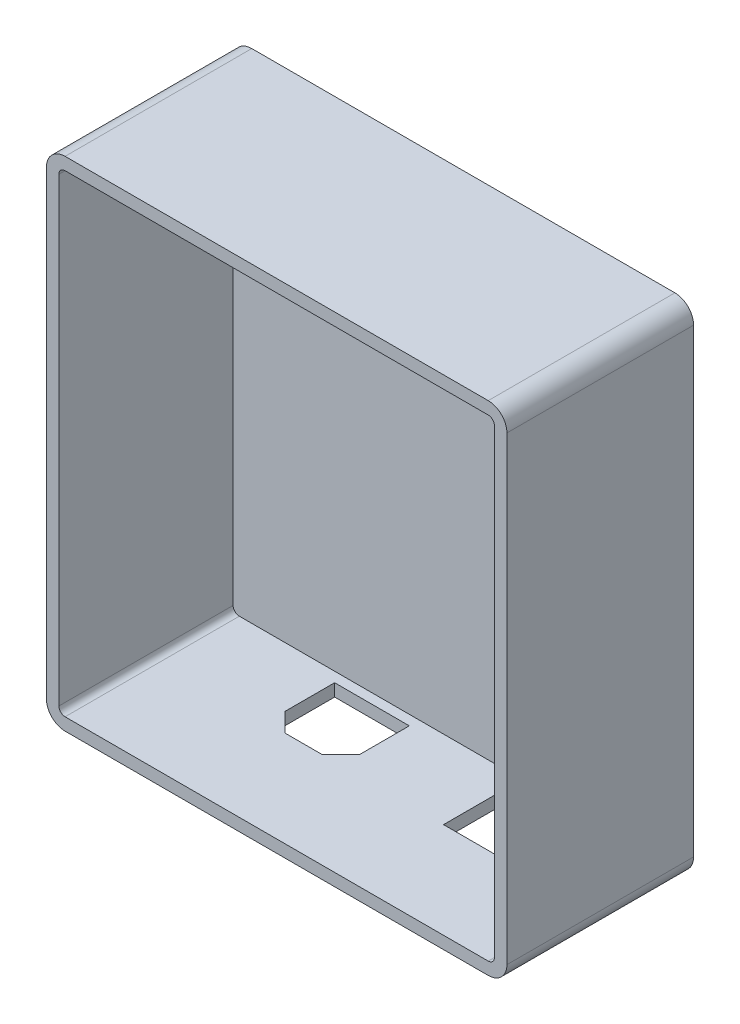
ISO-10303-21;
HEADER;
FILE_DESCRIPTION(('STEP AP214'),'2;1');
FILE_NAME('part.step','',(''),(''),'','','');
FILE_SCHEMA(('AUTOMOTIVE_DESIGN { 1 0 10303 214 1 1 1 1 }'));
ENDSEC;
DATA;
#1=APPLICATION_CONTEXT('core data for automotive mechanical design processes');
#2=APPLICATION_PROTOCOL_DEFINITION('international standard','automotive_design',2000,#1);
#3=PRODUCT_CONTEXT('',#1,'mechanical');
#4=PRODUCT('Part','Part','',(#3));
#5=PRODUCT_RELATED_PRODUCT_CATEGORY('part','',(#4));
#6=PRODUCT_DEFINITION_FORMATION('','',#4);
#7=PRODUCT_DEFINITION_CONTEXT('part definition',#1,'design');
#8=PRODUCT_DEFINITION('design','',#6,#7);
#9=PRODUCT_DEFINITION_SHAPE('','',#8);
#10=(LENGTH_UNIT() NAMED_UNIT(*) SI_UNIT(.MILLI.,.METRE.));
#11=(NAMED_UNIT(*) PLANE_ANGLE_UNIT() SI_UNIT($,.RADIAN.));
#12=(NAMED_UNIT(*) SI_UNIT($,.STERADIAN.) SOLID_ANGLE_UNIT());
#13=UNCERTAINTY_MEASURE_WITH_UNIT(LENGTH_MEASURE(1.E-05),#10,'distance_accuracy_value','');
#14=(GEOMETRIC_REPRESENTATION_CONTEXT(3) GLOBAL_UNCERTAINTY_ASSIGNED_CONTEXT((#13)) GLOBAL_UNIT_ASSIGNED_CONTEXT((#10,
#11,#12)) REPRESENTATION_CONTEXT('',''));
#15=CARTESIAN_POINT('',(0.,0.,0.));
#16=DIRECTION('',(0.,0.,1.));
#17=DIRECTION('',(1.,0.,0.));
#18=AXIS2_PLACEMENT_3D('',#15,#16,#17);
#19=CARTESIAN_POINT('',(-28.9172141918528,-56.2049934296978,30.));
#20=DIRECTION('',(0.,0.,-1.));
#21=DIRECTION('',(-1.,0.,0.));
#22=AXIS2_PLACEMENT_3D('',#19,#20,#21);
#23=CYLINDRICAL_SURFACE('',#22,3.);
#24=CARTESIAN_POINT('',(-28.9172141918528,-56.2049934296978,0.));
#25=DIRECTION('',(0.,0.,1.));
#26=DIRECTION('',(1.,0.,0.));
#27=AXIS2_PLACEMENT_3D('',#24,#25,#26);
#28=CIRCLE('',#27,3.);
#29=CARTESIAN_POINT('',(-31.9172141918528,-56.2049934296978,0.));
#30=VERTEX_POINT('',#29);
#31=CARTESIAN_POINT('',(-28.9172141918528,-59.2049934296978,0.));
#32=VERTEX_POINT('',#31);
#33=EDGE_CURVE('E321',#30,#32,#28,.T.);
#34=ORIENTED_EDGE('',*,*,#33,.T.);
#35=DIRECTION('',(0.,0.,-1.));
#36=VECTOR('',#35,1.);
#37=CARTESIAN_POINT('',(-28.9172141918528,-59.2049934296978,30.));
#38=LINE('',#37,#36);
#39=CARTESIAN_POINT('',(-28.9172141918528,-59.2049934296978,30.));
#40=VERTEX_POINT('',#39);
#41=EDGE_CURVE('E390',#40,#32,#38,.T.);
#42=ORIENTED_EDGE('',*,*,#41,.F.);
#43=CARTESIAN_POINT('',(-28.9172141918528,-56.2049934296978,30.));
#44=DIRECTION('',(0.,0.,1.));
#45=DIRECTION('',(1.,0.,0.));
#46=AXIS2_PLACEMENT_3D('',#43,#44,#45);
#47=CIRCLE('',#46,3.);
#48=CARTESIAN_POINT('',(-31.9172141918528,-56.2049934296978,30.));
#49=VERTEX_POINT('',#48);
#50=EDGE_CURVE('E336',#49,#40,#47,.T.);
#51=ORIENTED_EDGE('',*,*,#50,.F.);
#52=DIRECTION('',(0.,0.,-1.));
#53=VECTOR('',#52,1.);
#54=CARTESIAN_POINT('',(-31.9172141918528,-56.2049934296978,30.));
#55=LINE('',#54,#53);
#56=EDGE_CURVE('E354',#49,#30,#55,.T.);
#57=ORIENTED_EDGE('',*,*,#56,.T.);
#58=EDGE_LOOP('',(#34,#42,#51,#57));
#59=FACE_BOUND('',#58,.T.);
#60=ADVANCED_FACE('F37',(#59),#23,.T.);
#61=CARTESIAN_POINT('',(-28.9172141918528,-59.2049934296978,30.));
#62=DIRECTION('',(0.,1.,0.));
#63=DIRECTION('',(0.,0.,1.));
#64=AXIS2_PLACEMENT_3D('',#61,#62,#63);
#65=PLANE('',#64);
#66=DIRECTION('',(1.,0.,0.));
#67=VECTOR('',#66,1.);
#68=CARTESIAN_POINT('',(0.,-59.2049934296978,3.6));
#69=LINE('',#68,#67);
#70=CARTESIAN_POINT('',(-12.,-59.2049934296978,3.6));
#71=VERTEX_POINT('',#70);
#72=CARTESIAN_POINT('',(0.,-59.2049934296978,3.6));
#73=VERTEX_POINT('',#72);
#74=EDGE_CURVE('E226',#71,#73,#69,.T.);
#75=ORIENTED_EDGE('',*,*,#74,.F.);
#76=DIRECTION('',(0.,0.,-1.));
#77=VECTOR('',#76,1.);
#78=CARTESIAN_POINT('',(-12.,-59.2049934296978,3.6));
#79=LINE('',#78,#77);
#80=CARTESIAN_POINT('',(-12.,-59.2049934296978,11.6));
#81=VERTEX_POINT('',#80);
#82=EDGE_CURVE('E51',#81,#71,#79,.T.);
#83=ORIENTED_EDGE('',*,*,#82,.F.);
#84=DIRECTION('',(-0.707106781186547,0.,-0.707106781186548));
#85=VECTOR('',#84,1.);
#86=CARTESIAN_POINT('',(-12.,-59.2049934296978,11.6));
#87=LINE('',#86,#85);
#88=CARTESIAN_POINT('',(-9.00186724776904,-59.2049934296978,14.598132752231));
#89=VERTEX_POINT('',#88);
#90=EDGE_CURVE('E242',#89,#81,#87,.T.);
#91=ORIENTED_EDGE('',*,*,#90,.F.);
#92=DIRECTION('',(-1.,0.,0.));
#93=VECTOR('',#92,1.);
#94=CARTESIAN_POINT('',(-9.00186724776904,-59.2049934296978,14.598132752231));
#95=LINE('',#94,#93);
#96=CARTESIAN_POINT('',(-3.00186724776904,-59.2049934296978,14.598132752231));
#97=VERTEX_POINT('',#96);
#98=EDGE_CURVE('E236',#97,#89,#95,.T.);
#99=ORIENTED_EDGE('',*,*,#98,.F.);
#100=DIRECTION('',(-0.707987558436095,0.,0.70622490546546));
#101=VECTOR('',#100,1.);
#102=CARTESIAN_POINT('',(-3.00186724776904,-59.2049934296978,14.598132752231));
#103=LINE('',#102,#101);
#104=CARTESIAN_POINT('',(0.,-59.2049934296978,11.6037391530574));
#105=VERTEX_POINT('',#104);
#106=EDGE_CURVE('E234',#105,#97,#103,.T.);
#107=ORIENTED_EDGE('',*,*,#106,.F.);
#108=DIRECTION('',(0.,0.,1.));
#109=VECTOR('',#108,1.);
#110=CARTESIAN_POINT('',(0.,-59.2049934296978,11.6037391530574));
#111=LINE('',#110,#109);
#112=EDGE_CURVE('E216',#73,#105,#111,.T.);
#113=ORIENTED_EDGE('',*,*,#112,.F.);
#114=EDGE_LOOP('',(#75,#83,#91,#99,#107,#113));
#115=FACE_BOUND('',#114,.T.);
#116=DIRECTION('',(1.,0.,0.));
#117=VECTOR('',#116,1.);
#118=CARTESIAN_POINT('',(16.5,-59.2049934296978,3.6));
#119=LINE('',#118,#117);
#120=CARTESIAN_POINT('',(16.5,-59.2049934296978,3.6));
#121=VERTEX_POINT('',#120);
#122=CARTESIAN_POINT('',(25.5,-59.2049934296978,3.6));
#123=VERTEX_POINT('',#122);
#124=EDGE_CURVE('E255',#121,#123,#119,.T.);
#125=ORIENTED_EDGE('',*,*,#124,.F.);
#126=DIRECTION('',(0.,0.,-1.));
#127=VECTOR('',#126,1.);
#128=CARTESIAN_POINT('',(16.5,-59.2049934296978,14.6));
#129=LINE('',#128,#127);
#130=CARTESIAN_POINT('',(16.5,-59.2049934296978,14.6));
#131=VERTEX_POINT('',#130);
#132=EDGE_CURVE('E59',#131,#121,#129,.T.);
#133=ORIENTED_EDGE('',*,*,#132,.F.);
#134=DIRECTION('',(-1.,0.,0.));
#135=VECTOR('',#134,1.);
#136=CARTESIAN_POINT('',(16.5,-59.2049934296978,14.6));
#137=LINE('',#136,#135);
#138=CARTESIAN_POINT('',(25.5,-59.2049934296978,14.6));
#139=VERTEX_POINT('',#138);
#140=EDGE_CURVE('E261',#139,#131,#137,.T.);
#141=ORIENTED_EDGE('',*,*,#140,.F.);
#142=DIRECTION('',(0.,0.,1.));
#143=VECTOR('',#142,1.);
#144=CARTESIAN_POINT('',(25.5,-59.2049934296978,14.6));
#145=LINE('',#144,#143);
#146=EDGE_CURVE('E258',#123,#139,#145,.T.);
#147=ORIENTED_EDGE('',*,*,#146,.F.);
#148=EDGE_LOOP('',(#125,#133,#141,#147));
#149=FACE_BOUND('',#148,.T.);
#150=DIRECTION('',(1.,0.,0.));
#151=VECTOR('',#150,1.);
#152=CARTESIAN_POINT('',(-28.9172141918528,-59.2049934296978,0.));
#153=LINE('',#152,#151);
#154=CARTESIAN_POINT('',(39.0827858081472,-59.2049934296978,0.));
#155=VERTEX_POINT('',#154);
#156=EDGE_CURVE('E357',#32,#155,#153,.T.);
#157=ORIENTED_EDGE('',*,*,#156,.T.);
#158=DIRECTION('',(0.,0.,-1.));
#159=VECTOR('',#158,1.);
#160=CARTESIAN_POINT('',(39.0827858081472,-59.2049934296978,30.));
#161=LINE('',#160,#159);
#162=CARTESIAN_POINT('',(39.0827858081472,-59.2049934296978,30.));
#163=VERTEX_POINT('',#162);
#164=EDGE_CURVE('E387',#163,#155,#161,.T.);
#165=ORIENTED_EDGE('',*,*,#164,.F.);
#166=DIRECTION('',(1.,0.,0.));
#167=VECTOR('',#166,1.);
#168=CARTESIAN_POINT('',(-28.9172141918528,-59.2049934296978,30.));
#169=LINE('',#168,#167);
#170=EDGE_CURVE('E339',#40,#163,#169,.T.);
#171=ORIENTED_EDGE('',*,*,#170,.F.);
#172=ORIENTED_EDGE('',*,*,#41,.T.);
#173=EDGE_LOOP('',(#157,#165,#171,#172));
#174=FACE_BOUND('',#173,.T.);
#175=ADVANCED_FACE('F230',(#115,#149,#174),#65,.F.);
#176=CARTESIAN_POINT('',(39.0827858081472,-56.2049934296978,30.));
#177=DIRECTION('',(0.,0.,-1.));
#178=DIRECTION('',(-1.,0.,0.));
#179=AXIS2_PLACEMENT_3D('',#176,#177,#178);
#180=CYLINDRICAL_SURFACE('',#179,3.);
#181=CARTESIAN_POINT('',(39.0827858081472,-56.2049934296978,0.));
#182=DIRECTION('',(0.,0.,1.));
#183=DIRECTION('',(1.,0.,0.));
#184=AXIS2_PLACEMENT_3D('',#181,#182,#183);
#185=CIRCLE('',#184,3.);
#186=CARTESIAN_POINT('',(42.0827858081472,-56.2049934296977,0.));
#187=VERTEX_POINT('',#186);
#188=EDGE_CURVE('E359',#155,#187,#185,.T.);
#189=ORIENTED_EDGE('',*,*,#188,.T.);
#190=DIRECTION('',(0.,0.,-1.));
#191=VECTOR('',#190,1.);
#192=CARTESIAN_POINT('',(42.0827858081472,-56.2049934296977,30.));
#193=LINE('',#192,#191);
#194=CARTESIAN_POINT('',(42.0827858081472,-56.2049934296977,30.));
#195=VERTEX_POINT('',#194);
#196=EDGE_CURVE('E384',#195,#187,#193,.T.);
#197=ORIENTED_EDGE('',*,*,#196,.F.);
#198=CARTESIAN_POINT('',(39.0827858081472,-56.2049934296978,30.));
#199=DIRECTION('',(0.,0.,1.));
#200=DIRECTION('',(1.,0.,0.));
#201=AXIS2_PLACEMENT_3D('',#198,#199,#200);
#202=CIRCLE('',#201,3.);
#203=EDGE_CURVE('E342',#163,#195,#202,.T.);
#204=ORIENTED_EDGE('',*,*,#203,.F.);
#205=ORIENTED_EDGE('',*,*,#164,.T.);
#206=EDGE_LOOP('',(#189,#197,#204,#205));
#207=FACE_BOUND('',#206,.T.);
#208=ADVANCED_FACE('F446',(#207),#180,.T.);
#209=CARTESIAN_POINT('',(42.0827858081472,17.7950065703022,30.));
#210=DIRECTION('',(-1.,0.,0.));
#211=DIRECTION('',(0.,-1.,0.));
#212=AXIS2_PLACEMENT_3D('',#209,#210,#211);
#213=PLANE('',#212);
#214=DIRECTION('',(0.,1.,0.));
#215=VECTOR('',#214,1.);
#216=CARTESIAN_POINT('',(42.0827858081472,17.7950065703022,0.));
#217=LINE('',#216,#215);
#218=CARTESIAN_POINT('',(42.0827858081472,17.7950065703022,0.));
#219=VERTEX_POINT('',#218);
#220=EDGE_CURVE('E361',#187,#219,#217,.T.);
#221=ORIENTED_EDGE('',*,*,#220,.T.);
#222=DIRECTION('',(0.,0.,-1.));
#223=VECTOR('',#222,1.);
#224=CARTESIAN_POINT('',(42.0827858081472,17.7950065703022,30.));
#225=LINE('',#224,#223);
#226=CARTESIAN_POINT('',(42.0827858081472,17.7950065703022,30.));
#227=VERTEX_POINT('',#226);
#228=EDGE_CURVE('E381',#227,#219,#225,.T.);
#229=ORIENTED_EDGE('',*,*,#228,.F.);
#230=DIRECTION('',(0.,1.,0.));
#231=VECTOR('',#230,1.);
#232=CARTESIAN_POINT('',(42.0827858081472,17.7950065703022,30.));
#233=LINE('',#232,#231);
#234=EDGE_CURVE('E344',#195,#227,#233,.T.);
#235=ORIENTED_EDGE('',*,*,#234,.F.);
#236=ORIENTED_EDGE('',*,*,#196,.T.);
#237=EDGE_LOOP('',(#221,#229,#235,#236));
#238=FACE_BOUND('',#237,.T.);
#239=ADVANCED_FACE('F482',(#238),#213,.F.);
#240=CARTESIAN_POINT('',(39.0827858081472,17.7950065703022,30.));
#241=DIRECTION('',(0.,0.,-1.));
#242=DIRECTION('',(-1.,0.,0.));
#243=AXIS2_PLACEMENT_3D('',#240,#241,#242);
#244=CYLINDRICAL_SURFACE('',#243,3.);
#245=CARTESIAN_POINT('',(39.0827858081472,17.7950065703022,0.));
#246=DIRECTION('',(0.,0.,1.));
#247=DIRECTION('',(-1.,0.,0.));
#248=AXIS2_PLACEMENT_3D('',#245,#246,#247);
#249=CIRCLE('',#248,3.);
#250=CARTESIAN_POINT('',(39.0827858081472,20.7950065703022,0.));
#251=VERTEX_POINT('',#250);
#252=EDGE_CURVE('E363',#219,#251,#249,.T.);
#253=ORIENTED_EDGE('',*,*,#252,.T.);
#254=DIRECTION('',(0.,0.,-1.));
#255=VECTOR('',#254,1.);
#256=CARTESIAN_POINT('',(39.0827858081472,20.7950065703022,30.));
#257=LINE('',#256,#255);
#258=CARTESIAN_POINT('',(39.0827858081472,20.7950065703022,30.));
#259=VERTEX_POINT('',#258);
#260=EDGE_CURVE('E378',#259,#251,#257,.T.);
#261=ORIENTED_EDGE('',*,*,#260,.F.);
#262=CARTESIAN_POINT('',(39.0827858081472,17.7950065703022,30.));
#263=DIRECTION('',(0.,0.,1.));
#264=DIRECTION('',(-1.,0.,0.));
#265=AXIS2_PLACEMENT_3D('',#262,#263,#264);
#266=CIRCLE('',#265,3.);
#267=EDGE_CURVE('E346',#227,#259,#266,.T.);
#268=ORIENTED_EDGE('',*,*,#267,.F.);
#269=ORIENTED_EDGE('',*,*,#228,.T.);
#270=EDGE_LOOP('',(#253,#261,#268,#269));
#271=FACE_BOUND('',#270,.T.);
#272=ADVANCED_FACE('F478',(#271),#244,.T.);
#273=CARTESIAN_POINT('',(-28.9172141918528,20.7950065703022,30.));
#274=DIRECTION('',(0.,-1.,0.));
#275=DIRECTION('',(0.,0.,-1.));
#276=AXIS2_PLACEMENT_3D('',#273,#274,#275);
#277=PLANE('',#276);
#278=DIRECTION('',(-1.,0.,0.));
#279=VECTOR('',#278,1.);
#280=CARTESIAN_POINT('',(-28.9172141918528,20.7950065703022,0.));
#281=LINE('',#280,#279);
#282=CARTESIAN_POINT('',(-28.9172141918528,20.7950065703022,0.));
#283=VERTEX_POINT('',#282);
#284=EDGE_CURVE('E365',#251,#283,#281,.T.);
#285=ORIENTED_EDGE('',*,*,#284,.T.);
#286=DIRECTION('',(0.,0.,-1.));
#287=VECTOR('',#286,1.);
#288=CARTESIAN_POINT('',(-28.9172141918528,20.7950065703022,30.));
#289=LINE('',#288,#287);
#290=CARTESIAN_POINT('',(-28.9172141918528,20.7950065703022,30.));
#291=VERTEX_POINT('',#290);
#292=EDGE_CURVE('E375',#291,#283,#289,.T.);
#293=ORIENTED_EDGE('',*,*,#292,.F.);
#294=DIRECTION('',(-1.,0.,0.));
#295=VECTOR('',#294,1.);
#296=CARTESIAN_POINT('',(-28.9172141918528,20.7950065703022,30.));
#297=LINE('',#296,#295);
#298=EDGE_CURVE('E348',#259,#291,#297,.T.);
#299=ORIENTED_EDGE('',*,*,#298,.F.);
#300=ORIENTED_EDGE('',*,*,#260,.T.);
#301=EDGE_LOOP('',(#285,#293,#299,#300));
#302=FACE_BOUND('',#301,.T.);
#303=ADVANCED_FACE('F473',(#302),#277,.F.);
#304=CARTESIAN_POINT('',(-28.9172141918528,17.7950065703022,30.));
#305=DIRECTION('',(0.,0.,-1.));
#306=DIRECTION('',(-1.,0.,0.));
#307=AXIS2_PLACEMENT_3D('',#304,#305,#306);
#308=CYLINDRICAL_SURFACE('',#307,3.);
#309=CARTESIAN_POINT('',(-28.9172141918528,17.7950065703022,0.));
#310=DIRECTION('',(0.,0.,1.));
#311=DIRECTION('',(1.,0.,0.));
#312=AXIS2_PLACEMENT_3D('',#309,#310,#311);
#313=CIRCLE('',#312,3.);
#314=CARTESIAN_POINT('',(-31.9172141918528,17.7950065703022,0.));
#315=VERTEX_POINT('',#314);
#316=EDGE_CURVE('E367',#283,#315,#313,.T.);
#317=ORIENTED_EDGE('',*,*,#316,.T.);
#318=DIRECTION('',(0.,0.,-1.));
#319=VECTOR('',#318,1.);
#320=CARTESIAN_POINT('',(-31.9172141918528,17.7950065703022,30.));
#321=LINE('',#320,#319);
#322=CARTESIAN_POINT('',(-31.9172141918528,17.7950065703022,30.));
#323=VERTEX_POINT('',#322);
#324=EDGE_CURVE('E372',#323,#315,#321,.T.);
#325=ORIENTED_EDGE('',*,*,#324,.F.);
#326=CARTESIAN_POINT('',(-28.9172141918528,17.7950065703022,30.));
#327=DIRECTION('',(0.,0.,1.));
#328=DIRECTION('',(1.,0.,0.));
#329=AXIS2_PLACEMENT_3D('',#326,#327,#328);
#330=CIRCLE('',#329,3.);
#331=EDGE_CURVE('E350',#291,#323,#330,.T.);
#332=ORIENTED_EDGE('',*,*,#331,.F.);
#333=ORIENTED_EDGE('',*,*,#292,.T.);
#334=EDGE_LOOP('',(#317,#325,#332,#333));
#335=FACE_BOUND('',#334,.T.);
#336=ADVANCED_FACE('F468',(#335),#308,.T.);
#337=CARTESIAN_POINT('',(-31.9172141918528,17.7950065703022,30.));
#338=DIRECTION('',(1.,0.,0.));
#339=DIRECTION('',(0.,1.,0.));
#340=AXIS2_PLACEMENT_3D('',#337,#338,#339);
#341=PLANE('',#340);
#342=DIRECTION('',(0.,-1.,0.));
#343=VECTOR('',#342,1.);
#344=CARTESIAN_POINT('',(-31.9172141918528,17.7950065703022,0.));
#345=LINE('',#344,#343);
#346=EDGE_CURVE('E340',#315,#30,#345,.T.);
#347=ORIENTED_EDGE('',*,*,#346,.T.);
#348=ORIENTED_EDGE('',*,*,#56,.F.);
#349=DIRECTION('',(0.,-1.,0.));
#350=VECTOR('',#349,1.);
#351=CARTESIAN_POINT('',(-31.9172141918528,17.7950065703022,30.));
#352=LINE('',#351,#350);
#353=EDGE_CURVE('E352',#323,#49,#352,.T.);
#354=ORIENTED_EDGE('',*,*,#353,.F.);
#355=ORIENTED_EDGE('',*,*,#324,.T.);
#356=EDGE_LOOP('',(#347,#348,#354,#355));
#357=FACE_BOUND('',#356,.T.);
#358=ADVANCED_FACE('F466',(#357),#341,.F.);
#359=CARTESIAN_POINT('',(-28.9172141918528,-56.2049934296978,30.));
#360=DIRECTION('',(0.,0.,1.));
#361=DIRECTION('',(1.,0.,0.));
#362=AXIS2_PLACEMENT_3D('',#359,#360,#361);
#363=PLANE('',#362);
#364=CARTESIAN_POINT('',(-28.9172141918528,-56.2049934296978,30.));
#365=DIRECTION('',(0.,0.,1.));
#366=DIRECTION('',(1.,0.,0.));
#367=AXIS2_PLACEMENT_3D('',#364,#365,#366);
#368=CIRCLE('',#367,1.);
#369=CARTESIAN_POINT('',(-29.9172141918528,-56.2049934296978,30.));
#370=VERTEX_POINT('',#369);
#371=CARTESIAN_POINT('',(-28.9172141918528,-57.2049934296978,30.));
#372=VERTEX_POINT('',#371);
#373=EDGE_CURVE('E247',#370,#372,#368,.T.);
#374=ORIENTED_EDGE('',*,*,#373,.F.);
#375=DIRECTION('',(0.,-1.,0.));
#376=VECTOR('',#375,1.);
#377=CARTESIAN_POINT('',(-29.9172141918528,17.7950065703022,30.));
#378=LINE('',#377,#376);
#379=CARTESIAN_POINT('',(-29.9172141918528,17.7950065703022,30.));
#380=VERTEX_POINT('',#379);
#381=EDGE_CURVE('E276',#380,#370,#378,.T.);
#382=ORIENTED_EDGE('',*,*,#381,.F.);
#383=CARTESIAN_POINT('',(-28.9172141918528,17.7950065703022,30.));
#384=DIRECTION('',(0.,0.,1.));
#385=DIRECTION('',(1.,0.,0.));
#386=AXIS2_PLACEMENT_3D('',#383,#384,#385);
#387=CIRCLE('',#386,0.999999999999999);
#388=CARTESIAN_POINT('',(-28.9172141918528,18.7950065703022,30.));
#389=VERTEX_POINT('',#388);
#390=EDGE_CURVE('E314',#389,#380,#387,.T.);
#391=ORIENTED_EDGE('',*,*,#390,.F.);
#392=DIRECTION('',(-1.,0.,0.));
#393=VECTOR('',#392,1.);
#394=CARTESIAN_POINT('',(39.0827858081472,18.7950065703022,30.));
#395=LINE('',#394,#393);
#396=CARTESIAN_POINT('',(39.0827858081472,18.7950065703022,30.));
#397=VERTEX_POINT('',#396);
#398=EDGE_CURVE('E311',#397,#389,#395,.T.);
#399=ORIENTED_EDGE('',*,*,#398,.F.);
#400=CARTESIAN_POINT('',(39.0827858081472,17.7950065703022,30.));
#401=DIRECTION('',(0.,0.,1.));
#402=DIRECTION('',(1.,0.,0.));
#403=AXIS2_PLACEMENT_3D('',#400,#401,#402);
#404=CIRCLE('',#403,1.);
#405=CARTESIAN_POINT('',(40.0827858081472,17.7950065703022,30.));
#406=VERTEX_POINT('',#405);
#407=EDGE_CURVE('E308',#406,#397,#404,.T.);
#408=ORIENTED_EDGE('',*,*,#407,.F.);
#409=DIRECTION('',(0.,1.,0.));
#410=VECTOR('',#409,1.);
#411=CARTESIAN_POINT('',(40.0827858081472,-56.2049934296978,30.));
#412=LINE('',#411,#410);
#413=CARTESIAN_POINT('',(40.0827858081472,-56.2049934296978,30.));
#414=VERTEX_POINT('',#413);
#415=EDGE_CURVE('E305',#414,#406,#412,.T.);
#416=ORIENTED_EDGE('',*,*,#415,.F.);
#417=CARTESIAN_POINT('',(39.0827858081472,-56.2049934296978,30.));
#418=DIRECTION('',(0.,0.,1.));
#419=DIRECTION('',(1.,0.,0.));
#420=AXIS2_PLACEMENT_3D('',#417,#418,#419);
#421=CIRCLE('',#420,1.);
#422=CARTESIAN_POINT('',(39.0827858081472,-57.2049934296978,30.));
#423=VERTEX_POINT('',#422);
#424=EDGE_CURVE('E302',#423,#414,#421,.T.);
#425=ORIENTED_EDGE('',*,*,#424,.F.);
#426=DIRECTION('',(1.,0.,0.));
#427=VECTOR('',#426,1.);
#428=CARTESIAN_POINT('',(-28.9172141918528,-57.2049934296978,30.));
#429=LINE('',#428,#427);
#430=EDGE_CURVE('E299',#372,#423,#429,.T.);
#431=ORIENTED_EDGE('',*,*,#430,.F.);
#432=EDGE_LOOP('',(#374,#382,#391,#399,#408,#416,#425,#431));
#433=FACE_BOUND('',#432,.T.);
#434=ORIENTED_EDGE('',*,*,#50,.T.);
#435=ORIENTED_EDGE('',*,*,#170,.T.);
#436=ORIENTED_EDGE('',*,*,#203,.T.);
#437=ORIENTED_EDGE('',*,*,#234,.T.);
#438=ORIENTED_EDGE('',*,*,#267,.T.);
#439=ORIENTED_EDGE('',*,*,#298,.T.);
#440=ORIENTED_EDGE('',*,*,#331,.T.);
#441=ORIENTED_EDGE('',*,*,#353,.T.);
#442=EDGE_LOOP('',(#434,#435,#436,#437,#438,#439,#440,#441));
#443=FACE_BOUND('',#442,.T.);
#444=ADVANCED_FACE('F461',(#433,#443),#363,.T.);
#445=CARTESIAN_POINT('',(-28.9172141918528,-56.2049934296978,0.));
#446=DIRECTION('',(0.,0.,1.));
#447=DIRECTION('',(1.,0.,0.));
#448=AXIS2_PLACEMENT_3D('',#445,#446,#447);
#449=PLANE('',#448);
#450=ORIENTED_EDGE('',*,*,#33,.F.);
#451=ORIENTED_EDGE('',*,*,#346,.F.);
#452=ORIENTED_EDGE('',*,*,#316,.F.);
#453=ORIENTED_EDGE('',*,*,#284,.F.);
#454=ORIENTED_EDGE('',*,*,#252,.F.);
#455=ORIENTED_EDGE('',*,*,#220,.F.);
#456=ORIENTED_EDGE('',*,*,#188,.F.);
#457=ORIENTED_EDGE('',*,*,#156,.F.);
#458=EDGE_LOOP('',(#450,#451,#452,#453,#454,#455,#456,#457));
#459=FACE_BOUND('',#458,.T.);
#460=ADVANCED_FACE('F453',(#459),#449,.F.);
#461=CARTESIAN_POINT('',(-28.9172141918528,-56.2049934296978,2.));
#462=DIRECTION('',(0.,0.,1.));
#463=DIRECTION('',(1.,0.,0.));
#464=AXIS2_PLACEMENT_3D('',#461,#462,#463);
#465=CYLINDRICAL_SURFACE('',#464,1.);
#466=ORIENTED_EDGE('',*,*,#373,.T.);
#467=DIRECTION('',(0.,0.,1.));
#468=VECTOR('',#467,1.);
#469=CARTESIAN_POINT('',(-28.9172141918528,-57.2049934296978,2.));
#470=LINE('',#469,#468);
#471=CARTESIAN_POINT('',(-28.9172141918528,-57.2049934296978,2.));
#472=VERTEX_POINT('',#471);
#473=EDGE_CURVE('E297',#472,#372,#470,.T.);
#474=ORIENTED_EDGE('',*,*,#473,.F.);
#475=CARTESIAN_POINT('',(-28.9172141918528,-56.2049934296978,2.));
#476=DIRECTION('',(0.,0.,1.));
#477=DIRECTION('',(1.,0.,0.));
#478=AXIS2_PLACEMENT_3D('',#475,#476,#477);
#479=CIRCLE('',#478,1.);
#480=CARTESIAN_POINT('',(-29.9172141918528,-56.2049934296978,2.));
#481=VERTEX_POINT('',#480);
#482=EDGE_CURVE('E272',#481,#472,#479,.T.);
#483=ORIENTED_EDGE('',*,*,#482,.F.);
#484=DIRECTION('',(0.,0.,1.));
#485=VECTOR('',#484,1.);
#486=CARTESIAN_POINT('',(-29.9172141918528,-56.2049934296978,2.));
#487=LINE('',#486,#485);
#488=EDGE_CURVE('E319',#481,#370,#487,.T.);
#489=ORIENTED_EDGE('',*,*,#488,.T.);
#490=EDGE_LOOP('',(#466,#474,#483,#489));
#491=FACE_BOUND('',#490,.T.);
#492=ADVANCED_FACE('F502',(#491),#465,.F.);
#493=CARTESIAN_POINT('',(-29.9172141918528,17.7950065703022,2.));
#494=DIRECTION('',(-1.,0.,0.));
#495=DIRECTION('',(0.,-1.,0.));
#496=AXIS2_PLACEMENT_3D('',#493,#494,#495);
#497=PLANE('',#496);
#498=ORIENTED_EDGE('',*,*,#381,.T.);
#499=ORIENTED_EDGE('',*,*,#488,.F.);
#500=DIRECTION('',(0.,-1.,0.));
#501=VECTOR('',#500,1.);
#502=CARTESIAN_POINT('',(-29.9172141918528,17.7950065703022,2.));
#503=LINE('',#502,#501);
#504=CARTESIAN_POINT('',(-29.9172141918528,17.7950065703022,2.));
#505=VERTEX_POINT('',#504);
#506=EDGE_CURVE('E294',#505,#481,#503,.T.);
#507=ORIENTED_EDGE('',*,*,#506,.F.);
#508=DIRECTION('',(0.,0.,1.));
#509=VECTOR('',#508,1.);
#510=CARTESIAN_POINT('',(-29.9172141918528,17.7950065703022,2.));
#511=LINE('',#510,#509);
#512=EDGE_CURVE('E322',#505,#380,#511,.T.);
#513=ORIENTED_EDGE('',*,*,#512,.T.);
#514=EDGE_LOOP('',(#498,#499,#507,#513));
#515=FACE_BOUND('',#514,.T.);
#516=ADVANCED_FACE('F508',(#515),#497,.F.);
#517=CARTESIAN_POINT('',(-28.9172141918528,17.7950065703022,2.));
#518=DIRECTION('',(0.,0.,1.));
#519=DIRECTION('',(1.,0.,0.));
#520=AXIS2_PLACEMENT_3D('',#517,#518,#519);
#521=CYLINDRICAL_SURFACE('',#520,0.999999999999999);
#522=ORIENTED_EDGE('',*,*,#390,.T.);
#523=ORIENTED_EDGE('',*,*,#512,.F.);
#524=CARTESIAN_POINT('',(-28.9172141918528,17.7950065703022,2.));
#525=DIRECTION('',(0.,0.,1.));
#526=DIRECTION('',(1.,0.,0.));
#527=AXIS2_PLACEMENT_3D('',#524,#525,#526);
#528=CIRCLE('',#527,0.999999999999999);
#529=CARTESIAN_POINT('',(-28.9172141918528,18.7950065703022,2.));
#530=VERTEX_POINT('',#529);
#531=EDGE_CURVE('E291',#530,#505,#528,.T.);
#532=ORIENTED_EDGE('',*,*,#531,.F.);
#533=DIRECTION('',(0.,0.,1.));
#534=VECTOR('',#533,1.);
#535=CARTESIAN_POINT('',(-28.9172141918528,18.7950065703022,2.));
#536=LINE('',#535,#534);
#537=EDGE_CURVE('E324',#530,#389,#536,.T.);
#538=ORIENTED_EDGE('',*,*,#537,.T.);
#539=EDGE_LOOP('',(#522,#523,#532,#538));
#540=FACE_BOUND('',#539,.T.);
#541=ADVANCED_FACE('F528',(#540),#521,.F.);
#542=CARTESIAN_POINT('',(39.0827858081472,18.7950065703022,2.));
#543=DIRECTION('',(0.,1.,0.));
#544=DIRECTION('',(0.,0.,1.));
#545=AXIS2_PLACEMENT_3D('',#542,#543,#544);
#546=PLANE('',#545);
#547=ORIENTED_EDGE('',*,*,#398,.T.);
#548=ORIENTED_EDGE('',*,*,#537,.F.);
#549=DIRECTION('',(-1.,0.,0.));
#550=VECTOR('',#549,1.);
#551=CARTESIAN_POINT('',(39.0827858081472,18.7950065703022,2.));
#552=LINE('',#551,#550);
#553=CARTESIAN_POINT('',(39.0827858081472,18.7950065703022,2.));
#554=VERTEX_POINT('',#553);
#555=EDGE_CURVE('E288',#554,#530,#552,.T.);
#556=ORIENTED_EDGE('',*,*,#555,.F.);
#557=DIRECTION('',(0.,0.,1.));
#558=VECTOR('',#557,1.);
#559=CARTESIAN_POINT('',(39.0827858081472,18.7950065703022,2.));
#560=LINE('',#559,#558);
#561=EDGE_CURVE('E326',#554,#397,#560,.T.);
#562=ORIENTED_EDGE('',*,*,#561,.T.);
#563=EDGE_LOOP('',(#547,#548,#556,#562));
#564=FACE_BOUND('',#563,.T.);
#565=ADVANCED_FACE('F524',(#564),#546,.F.);
#566=CARTESIAN_POINT('',(39.0827858081472,17.7950065703022,2.));
#567=DIRECTION('',(0.,0.,1.));
#568=DIRECTION('',(1.,0.,0.));
#569=AXIS2_PLACEMENT_3D('',#566,#567,#568);
#570=CYLINDRICAL_SURFACE('',#569,1.);
#571=ORIENTED_EDGE('',*,*,#407,.T.);
#572=ORIENTED_EDGE('',*,*,#561,.F.);
#573=CARTESIAN_POINT('',(39.0827858081472,17.7950065703022,2.));
#574=DIRECTION('',(0.,0.,1.));
#575=DIRECTION('',(1.,0.,0.));
#576=AXIS2_PLACEMENT_3D('',#573,#574,#575);
#577=CIRCLE('',#576,1.);
#578=CARTESIAN_POINT('',(40.0827858081472,17.7950065703022,2.));
#579=VERTEX_POINT('',#578);
#580=EDGE_CURVE('E285',#579,#554,#577,.T.);
#581=ORIENTED_EDGE('',*,*,#580,.F.);
#582=DIRECTION('',(0.,0.,1.));
#583=VECTOR('',#582,1.);
#584=CARTESIAN_POINT('',(40.0827858081472,17.7950065703022,2.));
#585=LINE('',#584,#583);
#586=EDGE_CURVE('E328',#579,#406,#585,.T.);
#587=ORIENTED_EDGE('',*,*,#586,.T.);
#588=EDGE_LOOP('',(#571,#572,#581,#587));
#589=FACE_BOUND('',#588,.T.);
#590=ADVANCED_FACE('F520',(#589),#570,.F.);
#591=CARTESIAN_POINT('',(40.0827858081472,-56.2049934296978,2.));
#592=DIRECTION('',(1.,0.,0.));
#593=DIRECTION('',(0.,1.,0.));
#594=AXIS2_PLACEMENT_3D('',#591,#592,#593);
#595=PLANE('',#594);
#596=ORIENTED_EDGE('',*,*,#415,.T.);
#597=ORIENTED_EDGE('',*,*,#586,.F.);
#598=DIRECTION('',(0.,1.,0.));
#599=VECTOR('',#598,1.);
#600=CARTESIAN_POINT('',(40.0827858081472,-56.2049934296978,2.));
#601=LINE('',#600,#599);
#602=CARTESIAN_POINT('',(40.0827858081472,-56.2049934296978,2.));
#603=VERTEX_POINT('',#602);
#604=EDGE_CURVE('E282',#603,#579,#601,.T.);
#605=ORIENTED_EDGE('',*,*,#604,.F.);
#606=DIRECTION('',(0.,0.,1.));
#607=VECTOR('',#606,1.);
#608=CARTESIAN_POINT('',(40.0827858081472,-56.2049934296978,2.));
#609=LINE('',#608,#607);
#610=EDGE_CURVE('E330',#603,#414,#609,.T.);
#611=ORIENTED_EDGE('',*,*,#610,.T.);
#612=EDGE_LOOP('',(#596,#597,#605,#611));
#613=FACE_BOUND('',#612,.T.);
#614=ADVANCED_FACE('F516',(#613),#595,.F.);
#615=CARTESIAN_POINT('',(39.0827858081472,-56.2049934296978,2.));
#616=DIRECTION('',(0.,0.,1.));
#617=DIRECTION('',(1.,0.,0.));
#618=AXIS2_PLACEMENT_3D('',#615,#616,#617);
#619=CYLINDRICAL_SURFACE('',#618,1.);
#620=ORIENTED_EDGE('',*,*,#424,.T.);
#621=ORIENTED_EDGE('',*,*,#610,.F.);
#622=CARTESIAN_POINT('',(39.0827858081472,-56.2049934296978,2.));
#623=DIRECTION('',(0.,0.,1.));
#624=DIRECTION('',(1.,0.,0.));
#625=AXIS2_PLACEMENT_3D('',#622,#623,#624);
#626=CIRCLE('',#625,1.);
#627=CARTESIAN_POINT('',(39.0827858081472,-57.2049934296978,2.));
#628=VERTEX_POINT('',#627);
#629=EDGE_CURVE('E279',#628,#603,#626,.T.);
#630=ORIENTED_EDGE('',*,*,#629,.F.);
#631=DIRECTION('',(0.,0.,1.));
#632=VECTOR('',#631,1.);
#633=CARTESIAN_POINT('',(39.0827858081472,-57.2049934296978,2.));
#634=LINE('',#633,#632);
#635=EDGE_CURVE('E332',#628,#423,#634,.T.);
#636=ORIENTED_EDGE('',*,*,#635,.T.);
#637=EDGE_LOOP('',(#620,#621,#630,#636));
#638=FACE_BOUND('',#637,.T.);
#639=ADVANCED_FACE('F513',(#638),#619,.F.);
#640=CARTESIAN_POINT('',(-28.9172141918528,-57.2049934296978,2.));
#641=DIRECTION('',(0.,-1.,0.));
#642=DIRECTION('',(0.,0.,-1.));
#643=AXIS2_PLACEMENT_3D('',#640,#641,#642);
#644=PLANE('',#643);
#645=DIRECTION('',(-0.707106781186547,0.,-0.707106781186548));
#646=VECTOR('',#645,1.);
#647=CARTESIAN_POINT('',(-25.2586070959264,-57.2049934296978,-1.65860709592641));
#648=LINE('',#647,#646);
#649=CARTESIAN_POINT('',(-9.00186724776904,-57.2049934296978,14.598132752231));
#650=VERTEX_POINT('',#649);
#651=CARTESIAN_POINT('',(-12.,-57.2049934296978,11.6));
#652=VERTEX_POINT('',#651);
#653=EDGE_CURVE('E44',#650,#652,#648,.T.);
#654=ORIENTED_EDGE('',*,*,#653,.T.);
#655=DIRECTION('',(0.,0.,-1.));
#656=VECTOR('',#655,1.);
#657=CARTESIAN_POINT('',(-12.,-57.2049934296978,2.));
#658=LINE('',#657,#656);
#659=CARTESIAN_POINT('',(-12.,-57.2049934296978,3.6));
#660=VERTEX_POINT('',#659);
#661=EDGE_CURVE('E11',#652,#660,#658,.T.);
#662=ORIENTED_EDGE('',*,*,#661,.T.);
#663=DIRECTION('',(1.,0.,0.));
#664=VECTOR('',#663,1.);
#665=CARTESIAN_POINT('',(-28.9172141918528,-57.2049934296978,3.6));
#666=LINE('',#665,#664);
#667=CARTESIAN_POINT('',(0.,-57.2049934296978,3.6));
#668=VERTEX_POINT('',#667);
#669=EDGE_CURVE('E405',#660,#668,#666,.T.);
#670=ORIENTED_EDGE('',*,*,#669,.T.);
#671=DIRECTION('',(0.,0.,1.));
#672=VECTOR('',#671,1.);
#673=CARTESIAN_POINT('',(0.,-57.2049934296978,2.));
#674=LINE('',#673,#672);
#675=CARTESIAN_POINT('',(0.,-57.2049934296978,11.6037391530574));
#676=VERTEX_POINT('',#675);
#677=EDGE_CURVE('E219',#668,#676,#674,.T.);
#678=ORIENTED_EDGE('',*,*,#677,.T.);
#679=DIRECTION('',(-0.707987558436095,0.,0.70622490546546));
#680=VECTOR('',#679,1.);
#681=CARTESIAN_POINT('',(-9.69279435983786,-57.2049934296978,21.2724016866103));
#682=LINE('',#681,#680);
#683=CARTESIAN_POINT('',(-3.00186724776904,-57.2049934296978,14.598132752231));
#684=VERTEX_POINT('',#683);
#685=EDGE_CURVE('E408',#676,#684,#682,.T.);
#686=ORIENTED_EDGE('',*,*,#685,.T.);
#687=DIRECTION('',(-1.,0.,0.));
#688=VECTOR('',#687,1.);
#689=CARTESIAN_POINT('',(-28.9172141918528,-57.2049934296978,14.598132752231));
#690=LINE('',#689,#688);
#691=EDGE_CURVE('E411',#684,#650,#690,.T.);
#692=ORIENTED_EDGE('',*,*,#691,.T.);
#693=EDGE_LOOP('',(#654,#662,#670,#678,#686,#692));
#694=FACE_BOUND('',#693,.T.);
#695=DIRECTION('',(-1.,0.,0.));
#696=VECTOR('',#695,1.);
#697=CARTESIAN_POINT('',(-28.9172141918528,-57.2049934296978,14.6));
#698=LINE('',#697,#696);
#699=CARTESIAN_POINT('',(25.5,-57.2049934296978,14.6));
#700=VERTEX_POINT('',#699);
#701=CARTESIAN_POINT('',(16.5,-57.2049934296978,14.6));
#702=VERTEX_POINT('',#701);
#703=EDGE_CURVE('E399',#700,#702,#698,.T.);
#704=ORIENTED_EDGE('',*,*,#703,.T.);
#705=DIRECTION('',(0.,0.,-1.));
#706=VECTOR('',#705,1.);
#707=CARTESIAN_POINT('',(16.5,-57.2049934296978,2.));
#708=LINE('',#707,#706);
#709=CARTESIAN_POINT('',(16.5,-57.2049934296978,3.6));
#710=VERTEX_POINT('',#709);
#711=EDGE_CURVE('E402',#702,#710,#708,.T.);
#712=ORIENTED_EDGE('',*,*,#711,.T.);
#713=DIRECTION('',(1.,0.,0.));
#714=VECTOR('',#713,1.);
#715=CARTESIAN_POINT('',(-28.9172141918528,-57.2049934296978,3.6));
#716=LINE('',#715,#714);
#717=CARTESIAN_POINT('',(25.5,-57.2049934296978,3.6));
#718=VERTEX_POINT('',#717);
#719=EDGE_CURVE('E393',#710,#718,#716,.T.);
#720=ORIENTED_EDGE('',*,*,#719,.T.);
#721=DIRECTION('',(0.,0.,1.));
#722=VECTOR('',#721,1.);
#723=CARTESIAN_POINT('',(25.5,-57.2049934296978,2.00000000000002));
#724=LINE('',#723,#722);
#725=EDGE_CURVE('E396',#718,#700,#724,.T.);
#726=ORIENTED_EDGE('',*,*,#725,.T.);
#727=EDGE_LOOP('',(#704,#712,#720,#726));
#728=FACE_BOUND('',#727,.T.);
#729=ORIENTED_EDGE('',*,*,#430,.T.);
#730=ORIENTED_EDGE('',*,*,#635,.F.);
#731=DIRECTION('',(1.,0.,0.));
#732=VECTOR('',#731,1.);
#733=CARTESIAN_POINT('',(-28.9172141918528,-57.2049934296978,2.));
#734=LINE('',#733,#732);
#735=EDGE_CURVE('E275',#472,#628,#734,.T.);
#736=ORIENTED_EDGE('',*,*,#735,.F.);
#737=ORIENTED_EDGE('',*,*,#473,.T.);
#738=EDGE_LOOP('',(#729,#730,#736,#737));
#739=FACE_BOUND('',#738,.T.);
#740=ADVANCED_FACE('F415',(#694,#728,#739),#644,.F.);
#741=CARTESIAN_POINT('',(-28.9172141918528,-56.2049934296978,2.));
#742=DIRECTION('',(0.,0.,1.));
#743=DIRECTION('',(1.,0.,0.));
#744=AXIS2_PLACEMENT_3D('',#741,#742,#743);
#745=PLANE('',#744);
#746=ORIENTED_EDGE('',*,*,#482,.T.);
#747=ORIENTED_EDGE('',*,*,#735,.T.);
#748=ORIENTED_EDGE('',*,*,#629,.T.);
#749=ORIENTED_EDGE('',*,*,#604,.T.);
#750=ORIENTED_EDGE('',*,*,#580,.T.);
#751=ORIENTED_EDGE('',*,*,#555,.T.);
#752=ORIENTED_EDGE('',*,*,#531,.T.);
#753=ORIENTED_EDGE('',*,*,#506,.T.);
#754=EDGE_LOOP('',(#746,#747,#748,#749,#750,#751,#752,#753));
#755=FACE_BOUND('',#754,.T.);
#756=ADVANCED_FACE('F512',(#755),#745,.T.);
#757=CARTESIAN_POINT('',(16.5,-56.2049934296978,14.6));
#758=DIRECTION('',(-1.,0.,0.));
#759=DIRECTION('',(0.,0.,1.));
#760=AXIS2_PLACEMENT_3D('',#757,#758,#759);
#761=PLANE('',#760);
#762=DIRECTION('',(0.,-1.,0.));
#763=VECTOR('',#762,1.);
#764=CARTESIAN_POINT('',(16.5,-56.2049934296978,14.6));
#765=LINE('',#764,#763);
#766=EDGE_CURVE('E265',#702,#131,#765,.T.);
#767=ORIENTED_EDGE('',*,*,#766,.T.);
#768=ORIENTED_EDGE('',*,*,#132,.T.);
#769=DIRECTION('',(0.,-1.,0.));
#770=VECTOR('',#769,1.);
#771=CARTESIAN_POINT('',(16.5,-56.2049934296978,3.6));
#772=LINE('',#771,#770);
#773=EDGE_CURVE('E264',#710,#121,#772,.T.);
#774=ORIENTED_EDGE('',*,*,#773,.F.);
#775=ORIENTED_EDGE('',*,*,#711,.F.);
#776=EDGE_LOOP('',(#767,#768,#774,#775));
#777=FACE_BOUND('',#776,.T.);
#778=ADVANCED_FACE('F538',(#777),#761,.F.);
#779=CARTESIAN_POINT('',(16.5,-56.2049934296978,14.6));
#780=DIRECTION('',(0.,0.,1.));
#781=DIRECTION('',(1.,0.,0.));
#782=AXIS2_PLACEMENT_3D('',#779,#780,#781);
#783=PLANE('',#782);
#784=DIRECTION('',(0.,-1.,0.));
#785=VECTOR('',#784,1.);
#786=CARTESIAN_POINT('',(25.5,-56.2049934296978,14.6));
#787=LINE('',#786,#785);
#788=EDGE_CURVE('E267',#700,#139,#787,.T.);
#789=ORIENTED_EDGE('',*,*,#788,.T.);
#790=ORIENTED_EDGE('',*,*,#140,.T.);
#791=ORIENTED_EDGE('',*,*,#766,.F.);
#792=ORIENTED_EDGE('',*,*,#703,.F.);
#793=EDGE_LOOP('',(#789,#790,#791,#792));
#794=FACE_BOUND('',#793,.T.);
#795=ADVANCED_FACE('F541',(#794),#783,.F.);
#796=CARTESIAN_POINT('',(25.5,-56.2049934296978,14.6));
#797=DIRECTION('',(1.,0.,0.));
#798=DIRECTION('',(0.,0.,-1.));
#799=AXIS2_PLACEMENT_3D('',#796,#797,#798);
#800=PLANE('',#799);
#801=DIRECTION('',(0.,-1.,0.));
#802=VECTOR('',#801,1.);
#803=CARTESIAN_POINT('',(25.5,-56.2049934296978,3.6));
#804=LINE('',#803,#802);
#805=EDGE_CURVE('E269',#718,#123,#804,.T.);
#806=ORIENTED_EDGE('',*,*,#805,.T.);
#807=ORIENTED_EDGE('',*,*,#146,.T.);
#808=ORIENTED_EDGE('',*,*,#788,.F.);
#809=ORIENTED_EDGE('',*,*,#725,.F.);
#810=EDGE_LOOP('',(#806,#807,#808,#809));
#811=FACE_BOUND('',#810,.T.);
#812=ADVANCED_FACE('F436',(#811),#800,.F.);
#813=CARTESIAN_POINT('',(16.5,-56.2049934296978,3.6));
#814=DIRECTION('',(0.,0.,-1.));
#815=DIRECTION('',(-1.,0.,0.));
#816=AXIS2_PLACEMENT_3D('',#813,#814,#815);
#817=PLANE('',#816);
#818=ORIENTED_EDGE('',*,*,#773,.T.);
#819=ORIENTED_EDGE('',*,*,#124,.T.);
#820=ORIENTED_EDGE('',*,*,#805,.F.);
#821=ORIENTED_EDGE('',*,*,#719,.F.);
#822=EDGE_LOOP('',(#818,#819,#820,#821));
#823=FACE_BOUND('',#822,.T.);
#824=ADVANCED_FACE('F429',(#823),#817,.F.);
#825=CARTESIAN_POINT('',(-12.,-56.2049934296978,3.6));
#826=DIRECTION('',(-1.,0.,0.));
#827=DIRECTION('',(0.,0.,1.));
#828=AXIS2_PLACEMENT_3D('',#825,#826,#827);
#829=PLANE('',#828);
#830=DIRECTION('',(0.,-1.,0.));
#831=VECTOR('',#830,1.);
#832=CARTESIAN_POINT('',(-12.,-56.2049934296978,11.6));
#833=LINE('',#832,#831);
#834=EDGE_CURVE('E245',#652,#81,#833,.T.);
#835=ORIENTED_EDGE('',*,*,#834,.T.);
#836=ORIENTED_EDGE('',*,*,#82,.T.);
#837=DIRECTION('',(0.,-1.,0.));
#838=VECTOR('',#837,1.);
#839=CARTESIAN_POINT('',(-12.,-56.2049934296978,3.6));
#840=LINE('',#839,#838);
#841=EDGE_CURVE('E223',#660,#71,#840,.T.);
#842=ORIENTED_EDGE('',*,*,#841,.F.);
#843=ORIENTED_EDGE('',*,*,#661,.F.);
#844=EDGE_LOOP('',(#835,#836,#842,#843));
#845=FACE_BOUND('',#844,.T.);
#846=ADVANCED_FACE('F427',(#845),#829,.F.);
#847=CARTESIAN_POINT('',(-12.,-56.2049934296978,11.6));
#848=DIRECTION('',(-0.707106781186548,0.,0.707106781186547));
#849=DIRECTION('',(0.707106781186547,0.,0.707106781186548));
#850=AXIS2_PLACEMENT_3D('',#847,#848,#849);
#851=PLANE('',#850);
#852=DIRECTION('',(0.,-1.,0.));
#853=VECTOR('',#852,1.);
#854=CARTESIAN_POINT('',(-9.00186724776904,-56.2049934296978,14.598132752231));
#855=LINE('',#854,#853);
#856=EDGE_CURVE('E248',#650,#89,#855,.T.);
#857=ORIENTED_EDGE('',*,*,#856,.T.);
#858=ORIENTED_EDGE('',*,*,#90,.T.);
#859=ORIENTED_EDGE('',*,*,#834,.F.);
#860=ORIENTED_EDGE('',*,*,#653,.F.);
#861=EDGE_LOOP('',(#857,#858,#859,#860));
#862=FACE_BOUND('',#861,.T.);
#863=ADVANCED_FACE('F420',(#862),#851,.F.);
#864=CARTESIAN_POINT('',(-9.00186724776904,-56.2049934296978,14.598132752231));
#865=DIRECTION('',(0.,0.,1.));
#866=DIRECTION('',(1.,0.,0.));
#867=AXIS2_PLACEMENT_3D('',#864,#865,#866);
#868=PLANE('',#867);
#869=DIRECTION('',(0.,-1.,0.));
#870=VECTOR('',#869,1.);
#871=CARTESIAN_POINT('',(-3.00186724776904,-56.2049934296978,14.598132752231));
#872=LINE('',#871,#870);
#873=EDGE_CURVE('E250',#684,#97,#872,.T.);
#874=ORIENTED_EDGE('',*,*,#873,.T.);
#875=ORIENTED_EDGE('',*,*,#98,.T.);
#876=ORIENTED_EDGE('',*,*,#856,.F.);
#877=ORIENTED_EDGE('',*,*,#691,.F.);
#878=EDGE_LOOP('',(#874,#875,#876,#877));
#879=FACE_BOUND('',#878,.T.);
#880=ADVANCED_FACE('F422',(#879),#868,.F.);
#881=CARTESIAN_POINT('',(-3.00186724776904,-56.2049934296978,14.598132752231));
#882=DIRECTION('',(0.70622490546546,0.,0.707987558436095));
#883=DIRECTION('',(0.707987558436095,0.,-0.70622490546546));
#884=AXIS2_PLACEMENT_3D('',#881,#882,#883);
#885=PLANE('',#884);
#886=DIRECTION('',(0.,-1.,0.));
#887=VECTOR('',#886,1.);
#888=CARTESIAN_POINT('',(0.,-56.2049934296978,11.6037391530574));
#889=LINE('',#888,#887);
#890=EDGE_CURVE('E222',#676,#105,#889,.T.);
#891=ORIENTED_EDGE('',*,*,#890,.T.);
#892=ORIENTED_EDGE('',*,*,#106,.T.);
#893=ORIENTED_EDGE('',*,*,#873,.F.);
#894=ORIENTED_EDGE('',*,*,#685,.F.);
#895=EDGE_LOOP('',(#891,#892,#893,#894));
#896=FACE_BOUND('',#895,.T.);
#897=ADVANCED_FACE('F426',(#896),#885,.F.);
#898=CARTESIAN_POINT('',(0.,-56.2049934296978,11.6037391530574));
#899=DIRECTION('',(1.,0.,0.));
#900=DIRECTION('',(0.,0.,-1.));
#901=AXIS2_PLACEMENT_3D('',#898,#899,#900);
#902=PLANE('',#901);
#903=DIRECTION('',(0.,-1.,0.));
#904=VECTOR('',#903,1.);
#905=CARTESIAN_POINT('',(0.,-56.2049934296978,3.6));
#906=LINE('',#905,#904);
#907=EDGE_CURVE('E211',#668,#73,#906,.T.);
#908=ORIENTED_EDGE('',*,*,#907,.T.);
#909=ORIENTED_EDGE('',*,*,#112,.T.);
#910=ORIENTED_EDGE('',*,*,#890,.F.);
#911=ORIENTED_EDGE('',*,*,#677,.F.);
#912=EDGE_LOOP('',(#908,#909,#910,#911));
#913=FACE_BOUND('',#912,.T.);
#914=ADVANCED_FACE('F213',(#913),#902,.F.);
#915=CARTESIAN_POINT('',(0.,-56.2049934296978,3.6));
#916=DIRECTION('',(0.,0.,-1.));
#917=DIRECTION('',(-1.,0.,0.));
#918=AXIS2_PLACEMENT_3D('',#915,#916,#917);
#919=PLANE('',#918);
#920=ORIENTED_EDGE('',*,*,#841,.T.);
#921=ORIENTED_EDGE('',*,*,#74,.T.);
#922=ORIENTED_EDGE('',*,*,#907,.F.);
#923=ORIENTED_EDGE('',*,*,#669,.F.);
#924=EDGE_LOOP('',(#920,#921,#922,#923));
#925=FACE_BOUND('',#924,.T.);
#926=ADVANCED_FACE('F227',(#925),#919,.F.);
#927=CLOSED_SHELL('',(#60,#175,#208,#239,#272,#303,#336,#358,#444,#460,#492,#516,#541,#565,#590,
#614,#639,#740,#756,#778,#795,#812,#824,#846,#863,#880,#897,#914,#926));
#928=MANIFOLD_SOLID_BREP('B2',#927);
#929=ADVANCED_BREP_SHAPE_REPRESENTATION('',(#18,#928),#14);
#930=SHAPE_DEFINITION_REPRESENTATION(#9,#929);
ENDSEC;
END-ISO-10303-21;
